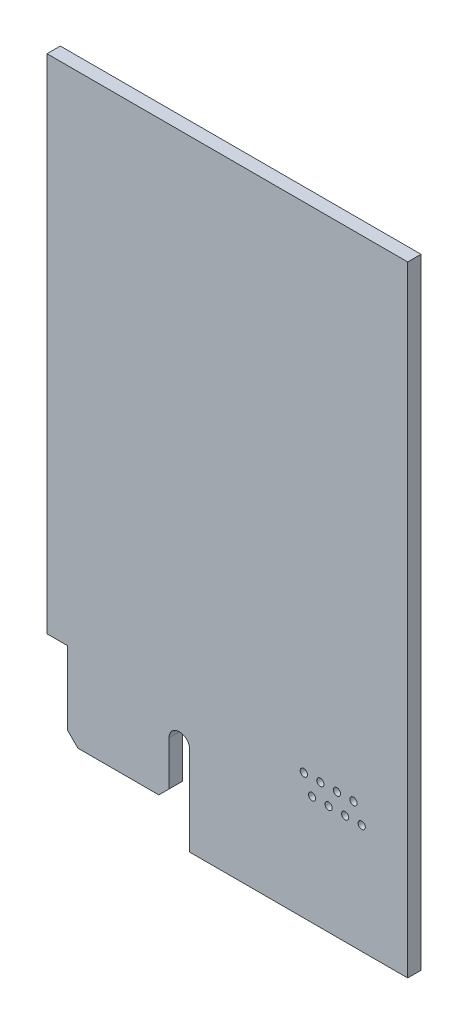
ISO-10303-21;
HEADER;
FILE_DESCRIPTION(('STEP AP214'),'2;1');
FILE_NAME('part.step','',(''),(''),'','','');
FILE_SCHEMA(('AUTOMOTIVE_DESIGN { 1 0 10303 214 1 1 1 1 }'));
ENDSEC;
DATA;
#1=APPLICATION_CONTEXT('core data for automotive mechanical design processes');
#2=APPLICATION_PROTOCOL_DEFINITION('international standard','automotive_design',2000,#1);
#3=PRODUCT_CONTEXT('',#1,'mechanical');
#4=PRODUCT('Part','Part','',(#3));
#5=PRODUCT_RELATED_PRODUCT_CATEGORY('part','',(#4));
#6=PRODUCT_DEFINITION_FORMATION('','',#4);
#7=PRODUCT_DEFINITION_CONTEXT('part definition',#1,'design');
#8=PRODUCT_DEFINITION('design','',#6,#7);
#9=PRODUCT_DEFINITION_SHAPE('','',#8);
#10=(LENGTH_UNIT() NAMED_UNIT(*) SI_UNIT(.MILLI.,.METRE.));
#11=(NAMED_UNIT(*) PLANE_ANGLE_UNIT() SI_UNIT($,.RADIAN.));
#12=(NAMED_UNIT(*) SI_UNIT($,.STERADIAN.) SOLID_ANGLE_UNIT());
#13=UNCERTAINTY_MEASURE_WITH_UNIT(LENGTH_MEASURE(1.E-05),#10,'distance_accuracy_value','');
#14=(GEOMETRIC_REPRESENTATION_CONTEXT(3) GLOBAL_UNCERTAINTY_ASSIGNED_CONTEXT((#13)) GLOBAL_UNIT_ASSIGNED_CONTEXT((#10,
#11,#12)) REPRESENTATION_CONTEXT('',''));
#15=CARTESIAN_POINT('',(0.,0.,0.));
#16=DIRECTION('',(0.,0.,1.));
#17=DIRECTION('',(1.,0.,0.));
#18=AXIS2_PLACEMENT_3D('',#15,#16,#17);
#19=CARTESIAN_POINT('',(-41.783,5.4482365,1.6374872));
#20=DIRECTION('',(0.,0.,-1.));
#21=DIRECTION('',(-1.,0.,0.));
#22=AXIS2_PLACEMENT_3D('',#19,#20,#21);
#23=PLANE('',#22);
#24=CARTESIAN_POINT('',(-5.6515,13.4366,1.6374872));
#25=DIRECTION('',(0.,0.,-1.));
#26=DIRECTION('',(-1.,0.,0.));
#27=AXIS2_PLACEMENT_3D('',#24,#25,#26);
#28=CIRCLE('',#27,0.4445);
#29=CARTESIAN_POINT('',(-6.096,13.4366,1.6374872));
#30=VERTEX_POINT('',#29);
#31=EDGE_CURVE('E194',#30,#30,#28,.T.);
#32=ORIENTED_EDGE('',*,*,#31,.T.);
#33=EDGE_LOOP('',(#32));
#34=FACE_BOUND('',#33,.T.);
#35=CARTESIAN_POINT('',(-6.6675,15.4686,1.6374872));
#36=DIRECTION('',(0.,0.,-1.));
#37=DIRECTION('',(-1.,0.,0.));
#38=AXIS2_PLACEMENT_3D('',#35,#36,#37);
#39=CIRCLE('',#38,0.4445);
#40=CARTESIAN_POINT('',(-7.112,15.4686,1.6374872));
#41=VERTEX_POINT('',#40);
#42=EDGE_CURVE('E283',#41,#41,#39,.T.);
#43=ORIENTED_EDGE('',*,*,#42,.T.);
#44=EDGE_LOOP('',(#43));
#45=FACE_BOUND('',#44,.T.);
#46=CARTESIAN_POINT('',(-10.7315,15.4686,1.6374872));
#47=DIRECTION('',(0.,0.,-1.));
#48=DIRECTION('',(-1.,0.,0.));
#49=AXIS2_PLACEMENT_3D('',#46,#47,#48);
#50=CIRCLE('',#49,0.4445);
#51=CARTESIAN_POINT('',(-11.176,15.4686,1.6374872));
#52=VERTEX_POINT('',#51);
#53=EDGE_CURVE('E286',#52,#52,#50,.T.);
#54=ORIENTED_EDGE('',*,*,#53,.T.);
#55=EDGE_LOOP('',(#54));
#56=FACE_BOUND('',#55,.T.);
#57=CARTESIAN_POINT('',(-8.6995,15.4686,1.6374872));
#58=DIRECTION('',(0.,0.,-1.));
#59=DIRECTION('',(-1.,0.,0.));
#60=AXIS2_PLACEMENT_3D('',#57,#58,#59);
#61=CIRCLE('',#60,0.4445);
#62=CARTESIAN_POINT('',(-9.144,15.4686,1.6374872));
#63=VERTEX_POINT('',#62);
#64=EDGE_CURVE('E289',#63,#63,#61,.T.);
#65=ORIENTED_EDGE('',*,*,#64,.T.);
#66=EDGE_LOOP('',(#65));
#67=FACE_BOUND('',#66,.T.);
#68=CARTESIAN_POINT('',(-12.7635,15.4686,1.6374872));
#69=DIRECTION('',(0.,0.,-1.));
#70=DIRECTION('',(-1.,0.,0.));
#71=AXIS2_PLACEMENT_3D('',#68,#69,#70);
#72=CIRCLE('',#71,0.4445);
#73=CARTESIAN_POINT('',(-13.208,15.4686,1.6374872));
#74=VERTEX_POINT('',#73);
#75=EDGE_CURVE('E292',#74,#74,#72,.T.);
#76=ORIENTED_EDGE('',*,*,#75,.T.);
#77=EDGE_LOOP('',(#76));
#78=FACE_BOUND('',#77,.T.);
#79=CARTESIAN_POINT('',(-9.7155,13.43660254,1.6374872));
#80=DIRECTION('',(0.,0.,-1.));
#81=DIRECTION('',(-1.,0.,0.));
#82=AXIS2_PLACEMENT_3D('',#79,#80,#81);
#83=CIRCLE('',#82,0.4445);
#84=CARTESIAN_POINT('',(-10.16,13.43660254,1.6374872));
#85=VERTEX_POINT('',#84);
#86=EDGE_CURVE('E295',#85,#85,#83,.T.);
#87=ORIENTED_EDGE('',*,*,#86,.T.);
#88=EDGE_LOOP('',(#87));
#89=FACE_BOUND('',#88,.T.);
#90=CARTESIAN_POINT('',(-7.6835,13.4366,1.6374872));
#91=DIRECTION('',(0.,0.,-1.));
#92=DIRECTION('',(-1.,0.,0.));
#93=AXIS2_PLACEMENT_3D('',#90,#91,#92);
#94=CIRCLE('',#93,0.4445);
#95=CARTESIAN_POINT('',(-8.128,13.4366,1.6374872));
#96=VERTEX_POINT('',#95);
#97=EDGE_CURVE('E298',#96,#96,#94,.T.);
#98=ORIENTED_EDGE('',*,*,#97,.T.);
#99=EDGE_LOOP('',(#98));
#100=FACE_BOUND('',#99,.T.);
#101=CARTESIAN_POINT('',(-11.7475,13.4366,1.6374872));
#102=DIRECTION('',(0.,0.,-1.));
#103=DIRECTION('',(-1.,0.,0.));
#104=AXIS2_PLACEMENT_3D('',#101,#102,#103);
#105=CIRCLE('',#104,0.4445);
#106=CARTESIAN_POINT('',(-12.192,13.4366,1.6374872));
#107=VERTEX_POINT('',#106);
#108=EDGE_CURVE('E200',#107,#107,#105,.T.);
#109=ORIENTED_EDGE('',*,*,#108,.T.);
#110=EDGE_LOOP('',(#109));
#111=FACE_BOUND('',#110,.T.);
#112=DIRECTION('',(1.,0.,0.));
#113=VECTOR('',#112,1.);
#114=CARTESIAN_POINT('',(-30.5816635,4.191,1.6374872));
#115=LINE('',#114,#113);
#116=CARTESIAN_POINT('',(-30.5816635,4.19100000000004,1.6374872));
#117=VERTEX_POINT('',#116);
#118=CARTESIAN_POINT('',(-40.5257635,4.191,1.6374872));
#119=VERTEX_POINT('',#118);
#120=EDGE_CURVE('E219',#117,#119,#115,.F.);
#121=ORIENTED_EDGE('',*,*,#120,.F.);
#122=DIRECTION('',(0.707106066900187,0.707107495472187,0.));
#123=VECTOR('',#122,1.);
#124=CARTESIAN_POINT('',(-29.32442954,5.4482365,1.6374872));
#125=LINE('',#124,#123);
#126=CARTESIAN_POINT('',(-29.32442954,5.4482365,1.6374872));
#127=VERTEX_POINT('',#126);
#128=EDGE_CURVE('E233',#127,#117,#125,.F.);
#129=ORIENTED_EDGE('',*,*,#128,.F.);
#130=DIRECTION('',(0.,1.,0.));
#131=VECTOR('',#130,1.);
#132=CARTESIAN_POINT('',(-29.32442954,10.9092365,1.6374872));
#133=LINE('',#132,#131);
#134=CARTESIAN_POINT('',(-29.32442954,10.9092365,1.6374872));
#135=VERTEX_POINT('',#134);
#136=EDGE_CURVE('E111',#135,#127,#133,.F.);
#137=ORIENTED_EDGE('',*,*,#136,.F.);
#138=CARTESIAN_POINT('',(-28.05442954,10.9092365,1.6374872));
#139=DIRECTION('',(0.,0.,-1.));
#140=DIRECTION('',(-1.,0.,0.));
#141=AXIS2_PLACEMENT_3D('',#138,#139,#140);
#142=CIRCLE('',#141,1.27);
#143=CARTESIAN_POINT('',(-26.78442954,10.9092365,1.6374872));
#144=VERTEX_POINT('',#143);
#145=EDGE_CURVE('E20',#135,#144,#142,.T.);
#146=ORIENTED_EDGE('',*,*,#145,.T.);
#147=DIRECTION('',(0.,1.,0.));
#148=VECTOR('',#147,1.);
#149=CARTESIAN_POINT('',(-26.78442954,0.,1.6374872));
#150=LINE('',#149,#148);
#151=CARTESIAN_POINT('',(-26.78442954,0.,1.6374872));
#152=VERTEX_POINT('',#151);
#153=EDGE_CURVE('E108',#152,#144,#150,.T.);
#154=ORIENTED_EDGE('',*,*,#153,.F.);
#155=DIRECTION('',(1.,0.,0.));
#156=VECTOR('',#155,1.);
#157=CARTESIAN_POINT('',(0.,0.,1.6374872));
#158=LINE('',#157,#156);
#159=CARTESIAN_POINT('',(0.,0.,1.6374872));
#160=VERTEX_POINT('',#159);
#161=EDGE_CURVE('E132',#160,#152,#158,.F.);
#162=ORIENTED_EDGE('',*,*,#161,.F.);
#163=DIRECTION('',(0.,1.,0.));
#164=VECTOR('',#163,1.);
#165=CARTESIAN_POINT('',(0.,76.2,1.6374872));
#166=LINE('',#165,#164);
#167=CARTESIAN_POINT('',(0.,76.2,1.6374872));
#168=VERTEX_POINT('',#167);
#169=EDGE_CURVE('E145',#168,#160,#166,.F.);
#170=ORIENTED_EDGE('',*,*,#169,.F.);
#171=DIRECTION('',(1.,0.,0.));
#172=VECTOR('',#171,1.);
#173=CARTESIAN_POINT('',(-44.323,76.2,1.6374872));
#174=LINE('',#173,#172);
#175=CARTESIAN_POINT('',(-44.323,76.2,1.6374872));
#176=VERTEX_POINT('',#175);
#177=EDGE_CURVE('E156',#176,#168,#174,.T.);
#178=ORIENTED_EDGE('',*,*,#177,.F.);
#179=DIRECTION('',(0.,1.,0.));
#180=VECTOR('',#179,1.);
#181=CARTESIAN_POINT('',(-44.323,14.4652365,1.6374872));
#182=LINE('',#181,#180);
#183=CARTESIAN_POINT('',(-44.323,14.4652365,1.6374872));
#184=VERTEX_POINT('',#183);
#185=EDGE_CURVE('E167',#184,#176,#182,.T.);
#186=ORIENTED_EDGE('',*,*,#185,.F.);
#187=DIRECTION('',(1.,0.,0.));
#188=VECTOR('',#187,1.);
#189=CARTESIAN_POINT('',(-41.783,14.4652365,1.6374872));
#190=LINE('',#189,#188);
#191=CARTESIAN_POINT('',(-41.783,14.4652365,1.6374872));
#192=VERTEX_POINT('',#191);
#193=EDGE_CURVE('E178',#192,#184,#190,.F.);
#194=ORIENTED_EDGE('',*,*,#193,.F.);
#195=DIRECTION('',(0.,1.,0.));
#196=VECTOR('',#195,1.);
#197=CARTESIAN_POINT('',(-41.783,5.4482365,1.6374872));
#198=LINE('',#197,#196);
#199=CARTESIAN_POINT('',(-41.783,5.4482365,1.6374872));
#200=VERTEX_POINT('',#199);
#201=EDGE_CURVE('E189',#200,#192,#198,.T.);
#202=ORIENTED_EDGE('',*,*,#201,.F.);
#203=DIRECTION('',(0.707106781186548,-0.707106781186548,0.));
#204=VECTOR('',#203,1.);
#205=CARTESIAN_POINT('',(-40.5257635,4.191,1.6374872));
#206=LINE('',#205,#204);
#207=EDGE_CURVE('E201',#119,#200,#206,.F.);
#208=ORIENTED_EDGE('',*,*,#207,.F.);
#209=EDGE_LOOP('',(#121,#129,#137,#146,#154,#162,#170,#178,#186,#194,#202,#208));
#210=FACE_BOUND('',#209,.T.);
#211=ADVANCED_FACE('F17',(#34,#45,#56,#67,#78,#89,#100,#111,#210),#23,.F.);
#212=CARTESIAN_POINT('',(-41.783,5.4482365,0.));
#213=DIRECTION('',(-1.,0.,0.));
#214=DIRECTION('',(0.,0.,1.));
#215=AXIS2_PLACEMENT_3D('',#212,#213,#214);
#216=PLANE('',#215);
#217=DIRECTION('',(0.,0.,-1.));
#218=VECTOR('',#217,1.);
#219=CARTESIAN_POINT('',(-41.783,14.4652365,0.));
#220=LINE('',#219,#218);
#221=CARTESIAN_POINT('',(-41.783,14.4652365,0.));
#222=VERTEX_POINT('',#221);
#223=EDGE_CURVE('E186',#222,#192,#220,.F.);
#224=ORIENTED_EDGE('',*,*,#223,.F.);
#225=DIRECTION('',(0.,1.,0.));
#226=VECTOR('',#225,1.);
#227=CARTESIAN_POINT('',(-41.783,5.4482365,0.));
#228=LINE('',#227,#226);
#229=CARTESIAN_POINT('',(-41.783,5.4482365,0.));
#230=VERTEX_POINT('',#229);
#231=EDGE_CURVE('E183',#230,#222,#228,.T.);
#232=ORIENTED_EDGE('',*,*,#231,.F.);
#233=DIRECTION('',(0.,0.,1.));
#234=VECTOR('',#233,1.);
#235=CARTESIAN_POINT('',(-41.783,5.4482365,0.));
#236=LINE('',#235,#234);
#237=EDGE_CURVE('E197',#200,#230,#236,.F.);
#238=ORIENTED_EDGE('',*,*,#237,.F.);
#239=ORIENTED_EDGE('',*,*,#201,.T.);
#240=EDGE_LOOP('',(#224,#232,#238,#239));
#241=FACE_BOUND('',#240,.T.);
#242=ADVANCED_FACE('F331',(#241),#216,.T.);
#243=CARTESIAN_POINT('',(-41.783,14.4652365,0.));
#244=DIRECTION('',(0.,-1.,0.));
#245=DIRECTION('',(0.,0.,-1.));
#246=AXIS2_PLACEMENT_3D('',#243,#244,#245);
#247=PLANE('',#246);
#248=DIRECTION('',(0.,0.,1.));
#249=VECTOR('',#248,1.);
#250=CARTESIAN_POINT('',(-44.323,14.4652365,0.));
#251=LINE('',#250,#249);
#252=CARTESIAN_POINT('',(-44.323,14.4652365,0.));
#253=VERTEX_POINT('',#252);
#254=EDGE_CURVE('E175',#253,#184,#251,.T.);
#255=ORIENTED_EDGE('',*,*,#254,.F.);
#256=DIRECTION('',(-1.,0.,0.));
#257=VECTOR('',#256,1.);
#258=CARTESIAN_POINT('',(-41.783,14.4652365,0.));
#259=LINE('',#258,#257);
#260=EDGE_CURVE('E172',#222,#253,#259,.T.);
#261=ORIENTED_EDGE('',*,*,#260,.F.);
#262=ORIENTED_EDGE('',*,*,#223,.T.);
#263=ORIENTED_EDGE('',*,*,#193,.T.);
#264=EDGE_LOOP('',(#255,#261,#262,#263));
#265=FACE_BOUND('',#264,.T.);
#266=ADVANCED_FACE('F335',(#265),#247,.T.);
#267=CARTESIAN_POINT('',(-44.323,14.4652365,0.));
#268=DIRECTION('',(-1.,0.,0.));
#269=DIRECTION('',(0.,0.,1.));
#270=AXIS2_PLACEMENT_3D('',#267,#268,#269);
#271=PLANE('',#270);
#272=DIRECTION('',(0.,0.,1.));
#273=VECTOR('',#272,1.);
#274=CARTESIAN_POINT('',(-44.323,76.2,0.));
#275=LINE('',#274,#273);
#276=CARTESIAN_POINT('',(-44.323,76.2,0.));
#277=VERTEX_POINT('',#276);
#278=EDGE_CURVE('E164',#277,#176,#275,.T.);
#279=ORIENTED_EDGE('',*,*,#278,.F.);
#280=DIRECTION('',(0.,1.,0.));
#281=VECTOR('',#280,1.);
#282=CARTESIAN_POINT('',(-44.323,5.4482365,0.));
#283=LINE('',#282,#281);
#284=EDGE_CURVE('E161',#253,#277,#283,.T.);
#285=ORIENTED_EDGE('',*,*,#284,.F.);
#286=ORIENTED_EDGE('',*,*,#254,.T.);
#287=ORIENTED_EDGE('',*,*,#185,.T.);
#288=EDGE_LOOP('',(#279,#285,#286,#287));
#289=FACE_BOUND('',#288,.T.);
#290=ADVANCED_FACE('F338',(#289),#271,.T.);
#291=CARTESIAN_POINT('',(-44.323,76.2,0.));
#292=DIRECTION('',(0.,1.,0.));
#293=DIRECTION('',(0.,0.,1.));
#294=AXIS2_PLACEMENT_3D('',#291,#292,#293);
#295=PLANE('',#294);
#296=DIRECTION('',(0.,0.,-1.));
#297=VECTOR('',#296,1.);
#298=CARTESIAN_POINT('',(0.,76.2,0.));
#299=LINE('',#298,#297);
#300=CARTESIAN_POINT('',(0.,76.2,0.));
#301=VERTEX_POINT('',#300);
#302=EDGE_CURVE('E153',#301,#168,#299,.F.);
#303=ORIENTED_EDGE('',*,*,#302,.F.);
#304=DIRECTION('',(-1.,0.,0.));
#305=VECTOR('',#304,1.);
#306=CARTESIAN_POINT('',(-41.783,76.2,0.));
#307=LINE('',#306,#305);
#308=EDGE_CURVE('E150',#277,#301,#307,.F.);
#309=ORIENTED_EDGE('',*,*,#308,.F.);
#310=ORIENTED_EDGE('',*,*,#278,.T.);
#311=ORIENTED_EDGE('',*,*,#177,.T.);
#312=EDGE_LOOP('',(#303,#309,#310,#311));
#313=FACE_BOUND('',#312,.T.);
#314=ADVANCED_FACE('F342',(#313),#295,.T.);
#315=CARTESIAN_POINT('',(0.,76.2,0.));
#316=DIRECTION('',(1.,0.,0.));
#317=DIRECTION('',(0.,0.,-1.));
#318=AXIS2_PLACEMENT_3D('',#315,#316,#317);
#319=PLANE('',#318);
#320=DIRECTION('',(0.,0.,-1.));
#321=VECTOR('',#320,1.);
#322=CARTESIAN_POINT('',(0.,0.,0.));
#323=LINE('',#322,#321);
#324=CARTESIAN_POINT('',(0.,0.,0.));
#325=VERTEX_POINT('',#324);
#326=EDGE_CURVE('E142',#325,#160,#323,.F.);
#327=ORIENTED_EDGE('',*,*,#326,.F.);
#328=DIRECTION('',(0.,1.,0.));
#329=VECTOR('',#328,1.);
#330=CARTESIAN_POINT('',(0.,5.4482365,0.));
#331=LINE('',#330,#329);
#332=EDGE_CURVE('E139',#301,#325,#331,.F.);
#333=ORIENTED_EDGE('',*,*,#332,.F.);
#334=ORIENTED_EDGE('',*,*,#302,.T.);
#335=ORIENTED_EDGE('',*,*,#169,.T.);
#336=EDGE_LOOP('',(#327,#333,#334,#335));
#337=FACE_BOUND('',#336,.T.);
#338=ADVANCED_FACE('F346',(#337),#319,.T.);
#339=CARTESIAN_POINT('',(0.,0.,0.));
#340=DIRECTION('',(0.,-1.,0.));
#341=DIRECTION('',(0.,0.,-1.));
#342=AXIS2_PLACEMENT_3D('',#339,#340,#341);
#343=PLANE('',#342);
#344=DIRECTION('',(0.,0.,1.));
#345=VECTOR('',#344,1.);
#346=CARTESIAN_POINT('',(-26.78442954,0.,0.));
#347=LINE('',#346,#345);
#348=CARTESIAN_POINT('',(-26.78442954,0.,0.));
#349=VERTEX_POINT('',#348);
#350=EDGE_CURVE('E118',#349,#152,#347,.T.);
#351=ORIENTED_EDGE('',*,*,#350,.F.);
#352=DIRECTION('',(-1.,0.,0.));
#353=VECTOR('',#352,1.);
#354=CARTESIAN_POINT('',(-41.783,0.,0.));
#355=LINE('',#354,#353);
#356=EDGE_CURVE('E135',#325,#349,#355,.T.);
#357=ORIENTED_EDGE('',*,*,#356,.F.);
#358=ORIENTED_EDGE('',*,*,#326,.T.);
#359=ORIENTED_EDGE('',*,*,#161,.T.);
#360=EDGE_LOOP('',(#351,#357,#358,#359));
#361=FACE_BOUND('',#360,.T.);
#362=ADVANCED_FACE('F349',(#361),#343,.T.);
#363=CARTESIAN_POINT('',(-26.78442954,0.,0.));
#364=DIRECTION('',(-1.,0.,0.));
#365=DIRECTION('',(0.,0.,1.));
#366=AXIS2_PLACEMENT_3D('',#363,#364,#365);
#367=PLANE('',#366);
#368=DIRECTION('',(0.,0.,-1.));
#369=VECTOR('',#368,1.);
#370=CARTESIAN_POINT('',(-26.78442954,10.9092365,0.));
#371=LINE('',#370,#369);
#372=CARTESIAN_POINT('',(-26.78442954,10.9092365,0.));
#373=VERTEX_POINT('',#372);
#374=EDGE_CURVE('E113',#144,#373,#371,.T.);
#375=ORIENTED_EDGE('',*,*,#374,.T.);
#376=DIRECTION('',(0.,1.,0.));
#377=VECTOR('',#376,1.);
#378=CARTESIAN_POINT('',(-26.78442954,5.4482365,0.));
#379=LINE('',#378,#377);
#380=EDGE_CURVE('E138',#349,#373,#379,.T.);
#381=ORIENTED_EDGE('',*,*,#380,.F.);
#382=ORIENTED_EDGE('',*,*,#350,.T.);
#383=ORIENTED_EDGE('',*,*,#153,.T.);
#384=EDGE_LOOP('',(#375,#381,#382,#383));
#385=FACE_BOUND('',#384,.T.);
#386=ADVANCED_FACE('F115',(#385),#367,.T.);
#387=CARTESIAN_POINT('',(-28.05442954,10.9092365,0.));
#388=DIRECTION('',(0.,0.,-1.));
#389=DIRECTION('',(-1.,0.,0.));
#390=AXIS2_PLACEMENT_3D('',#387,#388,#389);
#391=CYLINDRICAL_SURFACE('',#390,1.27);
#392=ORIENTED_EDGE('',*,*,#145,.F.);
#393=DIRECTION('',(0.,0.,-1.));
#394=VECTOR('',#393,1.);
#395=CARTESIAN_POINT('',(-29.32442954,10.9092365,0.));
#396=LINE('',#395,#394);
#397=CARTESIAN_POINT('',(-29.32442954,10.9092365,0.));
#398=VERTEX_POINT('',#397);
#399=EDGE_CURVE('E124',#398,#135,#396,.F.);
#400=ORIENTED_EDGE('',*,*,#399,.F.);
#401=CARTESIAN_POINT('',(-28.05442954,10.9092365,0.));
#402=DIRECTION('',(0.,0.,-1.));
#403=DIRECTION('',(-1.,0.,0.));
#404=AXIS2_PLACEMENT_3D('',#401,#402,#403);
#405=CIRCLE('',#404,1.27);
#406=EDGE_CURVE('E122',#373,#398,#405,.F.);
#407=ORIENTED_EDGE('',*,*,#406,.F.);
#408=ORIENTED_EDGE('',*,*,#374,.F.);
#409=EDGE_LOOP('',(#392,#400,#407,#408));
#410=FACE_BOUND('',#409,.T.);
#411=ADVANCED_FACE('F120',(#410),#391,.F.);
#412=CARTESIAN_POINT('',(-29.32442954,10.9092365,0.));
#413=DIRECTION('',(1.,0.,0.));
#414=DIRECTION('',(0.,0.,-1.));
#415=AXIS2_PLACEMENT_3D('',#412,#413,#414);
#416=PLANE('',#415);
#417=DIRECTION('',(0.,0.,1.));
#418=VECTOR('',#417,1.);
#419=CARTESIAN_POINT('',(-29.32442954,5.4482365,0.));
#420=LINE('',#419,#418);
#421=CARTESIAN_POINT('',(-29.32442954,5.4482365,0.));
#422=VERTEX_POINT('',#421);
#423=EDGE_CURVE('E237',#422,#127,#420,.T.);
#424=ORIENTED_EDGE('',*,*,#423,.F.);
#425=DIRECTION('',(0.,1.,0.));
#426=VECTOR('',#425,1.);
#427=CARTESIAN_POINT('',(-29.32442954,5.4482365,0.));
#428=LINE('',#427,#426);
#429=EDGE_CURVE('E280',#398,#422,#428,.F.);
#430=ORIENTED_EDGE('',*,*,#429,.F.);
#431=ORIENTED_EDGE('',*,*,#399,.T.);
#432=ORIENTED_EDGE('',*,*,#136,.T.);
#433=EDGE_LOOP('',(#424,#430,#431,#432));
#434=FACE_BOUND('',#433,.T.);
#435=ADVANCED_FACE('F361',(#434),#416,.T.);
#436=CARTESIAN_POINT('',(-29.32442954,5.4482365,0.));
#437=DIRECTION('',(0.707107495472187,-0.707106066900187,0.));
#438=DIRECTION('',(0.707106066900187,0.707107495472187,0.));
#439=AXIS2_PLACEMENT_3D('',#436,#437,#438);
#440=PLANE('',#439);
#441=DIRECTION('',(0.,0.,-1.));
#442=VECTOR('',#441,1.);
#443=CARTESIAN_POINT('',(-30.5816635,4.191,0.));
#444=LINE('',#443,#442);
#445=CARTESIAN_POINT('',(-30.5816635,4.191,0.));
#446=VERTEX_POINT('',#445);
#447=EDGE_CURVE('E223',#446,#117,#444,.F.);
#448=ORIENTED_EDGE('',*,*,#447,.F.);
#449=DIRECTION('',(-0.707106066900116,-0.707107495472257,0.));
#450=VECTOR('',#449,1.);
#451=CARTESIAN_POINT('',(-29.32442954,5.4482365,0.));
#452=LINE('',#451,#450);
#453=EDGE_CURVE('E228',#422,#446,#452,.T.);
#454=ORIENTED_EDGE('',*,*,#453,.F.);
#455=ORIENTED_EDGE('',*,*,#423,.T.);
#456=ORIENTED_EDGE('',*,*,#128,.T.);
#457=EDGE_LOOP('',(#448,#454,#455,#456));
#458=FACE_BOUND('',#457,.T.);
#459=ADVANCED_FACE('F324',(#458),#440,.T.);
#460=CARTESIAN_POINT('',(-30.5816635,4.191,0.));
#461=DIRECTION('',(0.,-1.,0.));
#462=DIRECTION('',(0.,0.,-1.));
#463=AXIS2_PLACEMENT_3D('',#460,#461,#462);
#464=PLANE('',#463);
#465=DIRECTION('',(0.,0.,1.));
#466=VECTOR('',#465,1.);
#467=CARTESIAN_POINT('',(-40.5257635,4.191,0.));
#468=LINE('',#467,#466);
#469=CARTESIAN_POINT('',(-40.5257635,4.191,0.));
#470=VERTEX_POINT('',#469);
#471=EDGE_CURVE('E35',#470,#119,#468,.T.);
#472=ORIENTED_EDGE('',*,*,#471,.F.);
#473=DIRECTION('',(-1.,0.,0.));
#474=VECTOR('',#473,1.);
#475=CARTESIAN_POINT('',(-41.783,4.191,0.));
#476=LINE('',#475,#474);
#477=EDGE_CURVE('E208',#446,#470,#476,.T.);
#478=ORIENTED_EDGE('',*,*,#477,.F.);
#479=ORIENTED_EDGE('',*,*,#447,.T.);
#480=ORIENTED_EDGE('',*,*,#120,.T.);
#481=EDGE_LOOP('',(#472,#478,#479,#480));
#482=FACE_BOUND('',#481,.T.);
#483=ADVANCED_FACE('F321',(#482),#464,.T.);
#484=CARTESIAN_POINT('',(-40.5257635,4.191,0.));
#485=DIRECTION('',(-0.707106781186548,-0.707106781186548,0.));
#486=DIRECTION('',(0.707106781186548,-0.707106781186548,0.));
#487=AXIS2_PLACEMENT_3D('',#484,#485,#486);
#488=PLANE('',#487);
#489=ORIENTED_EDGE('',*,*,#237,.T.);
#490=DIRECTION('',(-0.707106781186548,0.707106781186547,0.));
#491=VECTOR('',#490,1.);
#492=CARTESIAN_POINT('',(-40.5257635,4.191,0.));
#493=LINE('',#492,#491);
#494=EDGE_CURVE('E204',#470,#230,#493,.T.);
#495=ORIENTED_EDGE('',*,*,#494,.F.);
#496=ORIENTED_EDGE('',*,*,#471,.T.);
#497=ORIENTED_EDGE('',*,*,#207,.T.);
#498=EDGE_LOOP('',(#489,#495,#496,#497));
#499=FACE_BOUND('',#498,.T.);
#500=ADVANCED_FACE('F308',(#499),#488,.T.);
#501=CARTESIAN_POINT('',(-11.7475,13.4366,0.));
#502=DIRECTION('',(0.,0.,-1.));
#503=DIRECTION('',(-1.,0.,0.));
#504=AXIS2_PLACEMENT_3D('',#501,#502,#503);
#505=CYLINDRICAL_SURFACE('',#504,0.4445);
#506=ORIENTED_EDGE('',*,*,#108,.F.);
#507=EDGE_LOOP('',(#506));
#508=FACE_BOUND('',#507,.T.);
#509=CARTESIAN_POINT('',(-11.7475,13.4366,0.));
#510=DIRECTION('',(0.,0.,-1.));
#511=DIRECTION('',(-1.,0.,0.));
#512=AXIS2_PLACEMENT_3D('',#509,#510,#511);
#513=CIRCLE('',#512,0.4445);
#514=CARTESIAN_POINT('',(-12.192,13.4366,0.));
#515=VERTEX_POINT('',#514);
#516=EDGE_CURVE('E207',#515,#515,#513,.F.);
#517=ORIENTED_EDGE('',*,*,#516,.F.);
#518=EDGE_LOOP('',(#517));
#519=FACE_BOUND('',#518,.T.);
#520=ADVANCED_FACE('F304',(#508,#519),#505,.F.);
#521=CARTESIAN_POINT('',(-7.6835,13.4366,0.));
#522=DIRECTION('',(0.,0.,-1.));
#523=DIRECTION('',(-1.,0.,0.));
#524=AXIS2_PLACEMENT_3D('',#521,#522,#523);
#525=CYLINDRICAL_SURFACE('',#524,0.4445);
#526=ORIENTED_EDGE('',*,*,#97,.F.);
#527=EDGE_LOOP('',(#526));
#528=FACE_BOUND('',#527,.T.);
#529=CARTESIAN_POINT('',(-7.6835,13.4366,0.));
#530=DIRECTION('',(0.,0.,-1.));
#531=DIRECTION('',(-1.,0.,0.));
#532=AXIS2_PLACEMENT_3D('',#529,#530,#531);
#533=CIRCLE('',#532,0.4445);
#534=CARTESIAN_POINT('',(-8.128,13.4366,0.));
#535=VERTEX_POINT('',#534);
#536=EDGE_CURVE('E274',#535,#535,#533,.F.);
#537=ORIENTED_EDGE('',*,*,#536,.F.);
#538=EDGE_LOOP('',(#537));
#539=FACE_BOUND('',#538,.T.);
#540=ADVANCED_FACE('F307',(#528,#539),#525,.F.);
#541=CARTESIAN_POINT('',(-9.7155,13.43660254,0.));
#542=DIRECTION('',(0.,0.,-1.));
#543=DIRECTION('',(-1.,0.,0.));
#544=AXIS2_PLACEMENT_3D('',#541,#542,#543);
#545=CYLINDRICAL_SURFACE('',#544,0.4445);
#546=ORIENTED_EDGE('',*,*,#86,.F.);
#547=EDGE_LOOP('',(#546));
#548=FACE_BOUND('',#547,.T.);
#549=CARTESIAN_POINT('',(-9.7155,13.43660254,0.));
#550=DIRECTION('',(0.,0.,-1.));
#551=DIRECTION('',(-1.,0.,0.));
#552=AXIS2_PLACEMENT_3D('',#549,#550,#551);
#553=CIRCLE('',#552,0.4445);
#554=CARTESIAN_POINT('',(-10.16,13.43660254,0.));
#555=VERTEX_POINT('',#554);
#556=EDGE_CURVE('E271',#555,#555,#553,.F.);
#557=ORIENTED_EDGE('',*,*,#556,.F.);
#558=EDGE_LOOP('',(#557));
#559=FACE_BOUND('',#558,.T.);
#560=ADVANCED_FACE('F407',(#548,#559),#545,.F.);
#561=CARTESIAN_POINT('',(-12.7635,15.4686,0.));
#562=DIRECTION('',(0.,0.,-1.));
#563=DIRECTION('',(-1.,0.,0.));
#564=AXIS2_PLACEMENT_3D('',#561,#562,#563);
#565=CYLINDRICAL_SURFACE('',#564,0.4445);
#566=ORIENTED_EDGE('',*,*,#75,.F.);
#567=EDGE_LOOP('',(#566));
#568=FACE_BOUND('',#567,.T.);
#569=CARTESIAN_POINT('',(-12.7635,15.4686,0.));
#570=DIRECTION('',(0.,0.,-1.));
#571=DIRECTION('',(-1.,0.,0.));
#572=AXIS2_PLACEMENT_3D('',#569,#570,#571);
#573=CIRCLE('',#572,0.4445);
#574=CARTESIAN_POINT('',(-13.208,15.4686,0.));
#575=VERTEX_POINT('',#574);
#576=EDGE_CURVE('E268',#575,#575,#573,.F.);
#577=ORIENTED_EDGE('',*,*,#576,.F.);
#578=EDGE_LOOP('',(#577));
#579=FACE_BOUND('',#578,.T.);
#580=ADVANCED_FACE('F414',(#568,#579),#565,.F.);
#581=CARTESIAN_POINT('',(-8.6995,15.4686,0.));
#582=DIRECTION('',(0.,0.,-1.));
#583=DIRECTION('',(-1.,0.,0.));
#584=AXIS2_PLACEMENT_3D('',#581,#582,#583);
#585=CYLINDRICAL_SURFACE('',#584,0.4445);
#586=ORIENTED_EDGE('',*,*,#64,.F.);
#587=EDGE_LOOP('',(#586));
#588=FACE_BOUND('',#587,.T.);
#589=CARTESIAN_POINT('',(-8.6995,15.4686,0.));
#590=DIRECTION('',(0.,0.,-1.));
#591=DIRECTION('',(-1.,0.,0.));
#592=AXIS2_PLACEMENT_3D('',#589,#590,#591);
#593=CIRCLE('',#592,0.4445);
#594=CARTESIAN_POINT('',(-9.144,15.4686,0.));
#595=VERTEX_POINT('',#594);
#596=EDGE_CURVE('E265',#595,#595,#593,.F.);
#597=ORIENTED_EDGE('',*,*,#596,.F.);
#598=EDGE_LOOP('',(#597));
#599=FACE_BOUND('',#598,.T.);
#600=ADVANCED_FACE('F451',(#588,#599),#585,.F.);
#601=CARTESIAN_POINT('',(-10.7315,15.4686,0.));
#602=DIRECTION('',(0.,0.,-1.));
#603=DIRECTION('',(-1.,0.,0.));
#604=AXIS2_PLACEMENT_3D('',#601,#602,#603);
#605=CYLINDRICAL_SURFACE('',#604,0.4445);
#606=ORIENTED_EDGE('',*,*,#53,.F.);
#607=EDGE_LOOP('',(#606));
#608=FACE_BOUND('',#607,.T.);
#609=CARTESIAN_POINT('',(-10.7315,15.4686,0.));
#610=DIRECTION('',(0.,0.,-1.));
#611=DIRECTION('',(-1.,0.,0.));
#612=AXIS2_PLACEMENT_3D('',#609,#610,#611);
#613=CIRCLE('',#612,0.4445);
#614=CARTESIAN_POINT('',(-11.176,15.4686,0.));
#615=VERTEX_POINT('',#614);
#616=EDGE_CURVE('E262',#615,#615,#613,.F.);
#617=ORIENTED_EDGE('',*,*,#616,.F.);
#618=EDGE_LOOP('',(#617));
#619=FACE_BOUND('',#618,.T.);
#620=ADVANCED_FACE('F459',(#608,#619),#605,.F.);
#621=CARTESIAN_POINT('',(-6.6675,15.4686,0.));
#622=DIRECTION('',(0.,0.,-1.));
#623=DIRECTION('',(-1.,0.,0.));
#624=AXIS2_PLACEMENT_3D('',#621,#622,#623);
#625=CYLINDRICAL_SURFACE('',#624,0.4445);
#626=ORIENTED_EDGE('',*,*,#42,.F.);
#627=EDGE_LOOP('',(#626));
#628=FACE_BOUND('',#627,.T.);
#629=CARTESIAN_POINT('',(-6.6675,15.4686,0.));
#630=DIRECTION('',(0.,0.,-1.));
#631=DIRECTION('',(-1.,0.,0.));
#632=AXIS2_PLACEMENT_3D('',#629,#630,#631);
#633=CIRCLE('',#632,0.4445);
#634=CARTESIAN_POINT('',(-7.112,15.4686,0.));
#635=VERTEX_POINT('',#634);
#636=EDGE_CURVE('E26',#635,#635,#633,.F.);
#637=ORIENTED_EDGE('',*,*,#636,.F.);
#638=EDGE_LOOP('',(#637));
#639=FACE_BOUND('',#638,.T.);
#640=ADVANCED_FACE('F468',(#628,#639),#625,.F.);
#641=CARTESIAN_POINT('',(-5.6515,13.4366,0.));
#642=DIRECTION('',(0.,0.,-1.));
#643=DIRECTION('',(-1.,0.,0.));
#644=AXIS2_PLACEMENT_3D('',#641,#642,#643);
#645=CYLINDRICAL_SURFACE('',#644,0.4445);
#646=ORIENTED_EDGE('',*,*,#31,.F.);
#647=EDGE_LOOP('',(#646));
#648=FACE_BOUND('',#647,.T.);
#649=CARTESIAN_POINT('',(-5.6515,13.4366,0.));
#650=DIRECTION('',(0.,0.,-1.));
#651=DIRECTION('',(-1.,0.,0.));
#652=AXIS2_PLACEMENT_3D('',#649,#650,#651);
#653=CIRCLE('',#652,0.4445);
#654=CARTESIAN_POINT('',(-6.096,13.4366,0.));
#655=VERTEX_POINT('',#654);
#656=EDGE_CURVE('E11',#655,#655,#653,.F.);
#657=ORIENTED_EDGE('',*,*,#656,.F.);
#658=EDGE_LOOP('',(#657));
#659=FACE_BOUND('',#658,.T.);
#660=ADVANCED_FACE('F315',(#648,#659),#645,.F.);
#661=CARTESIAN_POINT('',(-41.783,5.4482365,0.));
#662=DIRECTION('',(0.,0.,-1.));
#663=DIRECTION('',(-1.,0.,0.));
#664=AXIS2_PLACEMENT_3D('',#661,#662,#663);
#665=PLANE('',#664);
#666=ORIENTED_EDGE('',*,*,#656,.T.);
#667=EDGE_LOOP('',(#666));
#668=FACE_BOUND('',#667,.T.);
#669=ORIENTED_EDGE('',*,*,#636,.T.);
#670=EDGE_LOOP('',(#669));
#671=FACE_BOUND('',#670,.T.);
#672=ORIENTED_EDGE('',*,*,#616,.T.);
#673=EDGE_LOOP('',(#672));
#674=FACE_BOUND('',#673,.T.);
#675=ORIENTED_EDGE('',*,*,#596,.T.);
#676=EDGE_LOOP('',(#675));
#677=FACE_BOUND('',#676,.T.);
#678=ORIENTED_EDGE('',*,*,#576,.T.);
#679=EDGE_LOOP('',(#678));
#680=FACE_BOUND('',#679,.T.);
#681=ORIENTED_EDGE('',*,*,#556,.T.);
#682=EDGE_LOOP('',(#681));
#683=FACE_BOUND('',#682,.T.);
#684=ORIENTED_EDGE('',*,*,#536,.T.);
#685=EDGE_LOOP('',(#684));
#686=FACE_BOUND('',#685,.T.);
#687=ORIENTED_EDGE('',*,*,#516,.T.);
#688=EDGE_LOOP('',(#687));
#689=FACE_BOUND('',#688,.T.);
#690=ORIENTED_EDGE('',*,*,#477,.T.);
#691=ORIENTED_EDGE('',*,*,#494,.T.);
#692=ORIENTED_EDGE('',*,*,#231,.T.);
#693=ORIENTED_EDGE('',*,*,#260,.T.);
#694=ORIENTED_EDGE('',*,*,#284,.T.);
#695=ORIENTED_EDGE('',*,*,#308,.T.);
#696=ORIENTED_EDGE('',*,*,#332,.T.);
#697=ORIENTED_EDGE('',*,*,#356,.T.);
#698=ORIENTED_EDGE('',*,*,#380,.T.);
#699=ORIENTED_EDGE('',*,*,#406,.T.);
#700=ORIENTED_EDGE('',*,*,#429,.T.);
#701=ORIENTED_EDGE('',*,*,#453,.T.);
#702=EDGE_LOOP('',(#690,#691,#692,#693,#694,#695,#696,#697,#698,#699,#700,#701));
#703=FACE_BOUND('',#702,.T.);
#704=ADVANCED_FACE('F312',(#668,#671,#674,#677,#680,#683,#686,#689,#703),#665,.T.);
#705=CLOSED_SHELL('',(#211,#242,#266,#290,#314,#338,#362,#386,#411,#435,#459,#483,#500,#520,
#540,#560,#580,#600,#620,#640,#660,#704));
#706=MANIFOLD_SOLID_BREP('B1',#705);
#707=ADVANCED_BREP_SHAPE_REPRESENTATION('',(#18,#706),#14);
#708=SHAPE_DEFINITION_REPRESENTATION(#9,#707);
ENDSEC;
END-ISO-10303-21;
